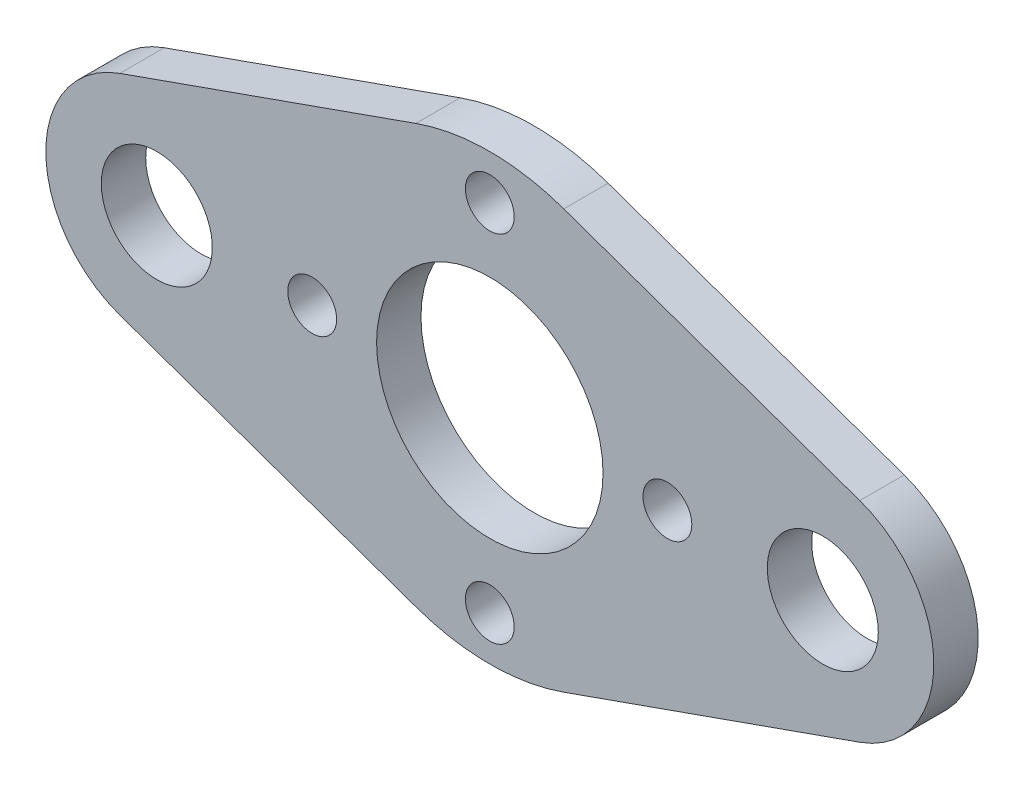
ISO-10303-21;
HEADER;
FILE_DESCRIPTION(('STEP AP214'),'2;1');
FILE_NAME('part.step','',(''),(''),'','','');
FILE_SCHEMA(('AUTOMOTIVE_DESIGN { 1 0 10303 214 1 1 1 1 }'));
ENDSEC;
DATA;
#1=APPLICATION_CONTEXT('core data for automotive mechanical design processes');
#2=APPLICATION_PROTOCOL_DEFINITION('international standard','automotive_design',2000,#1);
#3=PRODUCT_CONTEXT('',#1,'mechanical');
#4=PRODUCT('Part','Part','',(#3));
#5=PRODUCT_RELATED_PRODUCT_CATEGORY('part','',(#4));
#6=PRODUCT_DEFINITION_FORMATION('','',#4);
#7=PRODUCT_DEFINITION_CONTEXT('part definition',#1,'design');
#8=PRODUCT_DEFINITION('design','',#6,#7);
#9=PRODUCT_DEFINITION_SHAPE('','',#8);
#10=(LENGTH_UNIT() NAMED_UNIT(*) SI_UNIT(.MILLI.,.METRE.));
#11=(NAMED_UNIT(*) PLANE_ANGLE_UNIT() SI_UNIT($,.RADIAN.));
#12=(NAMED_UNIT(*) SI_UNIT($,.STERADIAN.) SOLID_ANGLE_UNIT());
#13=UNCERTAINTY_MEASURE_WITH_UNIT(LENGTH_MEASURE(1.E-05),#10,'distance_accuracy_value','');
#14=(GEOMETRIC_REPRESENTATION_CONTEXT(3) GLOBAL_UNCERTAINTY_ASSIGNED_CONTEXT((#13)) GLOBAL_UNIT_ASSIGNED_CONTEXT((#10,
#11,#12)) REPRESENTATION_CONTEXT('',''));
#15=CARTESIAN_POINT('',(0.,0.,0.));
#16=DIRECTION('',(0.,0.,1.));
#17=DIRECTION('',(1.,0.,0.));
#18=AXIS2_PLACEMENT_3D('',#15,#16,#17);
#19=CARTESIAN_POINT('',(0.,0.,2.));
#20=DIRECTION('',(0.,0.,1.));
#21=DIRECTION('',(1.,0.,0.));
#22=AXIS2_PLACEMENT_3D('',#19,#20,#21);
#23=PLANE('',#22);
#24=CARTESIAN_POINT('',(-8.,0.,2.));
#25=DIRECTION('',(0.,0.,1.));
#26=DIRECTION('',(1.,0.,0.));
#27=AXIS2_PLACEMENT_3D('',#24,#25,#26);
#28=CIRCLE('',#27,1.1);
#29=CARTESIAN_POINT('',(-6.9,0.,2.));
#30=VERTEX_POINT('',#29);
#31=EDGE_CURVE('E212',#30,#30,#28,.T.);
#32=ORIENTED_EDGE('',*,*,#31,.F.);
#33=EDGE_LOOP('',(#32));
#34=FACE_BOUND('',#33,.T.);
#35=CARTESIAN_POINT('',(8.,0.,2.));
#36=DIRECTION('',(0.,0.,1.));
#37=DIRECTION('',(1.,0.,0.));
#38=AXIS2_PLACEMENT_3D('',#35,#36,#37);
#39=CIRCLE('',#38,1.1);
#40=CARTESIAN_POINT('',(9.1,0.,2.));
#41=VERTEX_POINT('',#40);
#42=EDGE_CURVE('E200',#41,#41,#39,.T.);
#43=ORIENTED_EDGE('',*,*,#42,.F.);
#44=EDGE_LOOP('',(#43));
#45=FACE_BOUND('',#44,.T.);
#46=CARTESIAN_POINT('',(0.,8.,2.));
#47=DIRECTION('',(0.,0.,1.));
#48=DIRECTION('',(1.,0.,0.));
#49=AXIS2_PLACEMENT_3D('',#46,#47,#48);
#50=CIRCLE('',#49,1.1);
#51=CARTESIAN_POINT('',(1.1,8.,2.));
#52=VERTEX_POINT('',#51);
#53=EDGE_CURVE('E188',#52,#52,#50,.T.);
#54=ORIENTED_EDGE('',*,*,#53,.F.);
#55=EDGE_LOOP('',(#54));
#56=FACE_BOUND('',#55,.T.);
#57=CARTESIAN_POINT('',(0.,0.,2.));
#58=DIRECTION('',(0.,0.,1.));
#59=DIRECTION('',(1.,0.,0.));
#60=AXIS2_PLACEMENT_3D('',#57,#58,#59);
#61=CIRCLE('',#60,10.);
#62=CARTESIAN_POINT('',(3.33333333333333,9.42809041582063,2.));
#63=VERTEX_POINT('',#62);
#64=CARTESIAN_POINT('',(-3.33333333333333,9.42809041582063,2.));
#65=VERTEX_POINT('',#64);
#66=EDGE_CURVE('E151',#63,#65,#61,.T.);
#67=ORIENTED_EDGE('',*,*,#66,.T.);
#68=DIRECTION('',(-0.942809041582063,-0.333333333333333,0.));
#69=VECTOR('',#68,1.);
#70=CARTESIAN_POINT('',(-3.33333333333333,9.42809041582063,2.));
#71=LINE('',#70,#69);
#72=CARTESIAN_POINT('',(-16.6666666666667,4.71404520791031,2.));
#73=VERTEX_POINT('',#72);
#74=EDGE_CURVE('E99',#65,#73,#71,.T.);
#75=ORIENTED_EDGE('',*,*,#74,.T.);
#76=CARTESIAN_POINT('',(-15.,0.,2.));
#77=DIRECTION('',(0.,0.,1.));
#78=DIRECTION('',(-1.,0.,0.));
#79=AXIS2_PLACEMENT_3D('',#76,#77,#78);
#80=CIRCLE('',#79,5.);
#81=CARTESIAN_POINT('',(-16.6666666666667,-4.71404520791031,2.));
#82=VERTEX_POINT('',#81);
#83=EDGE_CURVE('E166',#73,#82,#80,.T.);
#84=ORIENTED_EDGE('',*,*,#83,.T.);
#85=DIRECTION('',(0.942809041582063,-0.333333333333333,0.));
#86=VECTOR('',#85,1.);
#87=CARTESIAN_POINT('',(-3.33333333333333,-9.42809041582063,2.));
#88=LINE('',#87,#86);
#89=CARTESIAN_POINT('',(-3.33333333333334,-9.42809041582063,2.));
#90=VERTEX_POINT('',#89);
#91=EDGE_CURVE('E179',#82,#90,#88,.T.);
#92=ORIENTED_EDGE('',*,*,#91,.T.);
#93=CARTESIAN_POINT('',(0.,0.,2.));
#94=DIRECTION('',(0.,0.,1.));
#95=DIRECTION('',(1.,0.,0.));
#96=AXIS2_PLACEMENT_3D('',#93,#94,#95);
#97=CIRCLE('',#96,9.99999999999999);
#98=CARTESIAN_POINT('',(3.33333333333333,-9.42809041582063,2.));
#99=VERTEX_POINT('',#98);
#100=EDGE_CURVE('E118',#90,#99,#97,.T.);
#101=ORIENTED_EDGE('',*,*,#100,.T.);
#102=DIRECTION('',(0.942809041582063,0.333333333333333,0.));
#103=VECTOR('',#102,1.);
#104=CARTESIAN_POINT('',(3.33333333333333,-9.42809041582063,2.));
#105=LINE('',#104,#103);
#106=CARTESIAN_POINT('',(16.6666666666667,-4.71404520791031,2.));
#107=VERTEX_POINT('',#106);
#108=EDGE_CURVE('E112',#99,#107,#105,.T.);
#109=ORIENTED_EDGE('',*,*,#108,.T.);
#110=CARTESIAN_POINT('',(15.,0.,2.));
#111=DIRECTION('',(0.,0.,1.));
#112=DIRECTION('',(1.,0.,0.));
#113=AXIS2_PLACEMENT_3D('',#110,#111,#112);
#114=CIRCLE('',#113,5.);
#115=CARTESIAN_POINT('',(16.6666666666667,4.71404520791031,2.));
#116=VERTEX_POINT('',#115);
#117=EDGE_CURVE('E116',#107,#116,#114,.T.);
#118=ORIENTED_EDGE('',*,*,#117,.T.);
#119=DIRECTION('',(-0.942809041582063,0.333333333333333,0.));
#120=VECTOR('',#119,1.);
#121=CARTESIAN_POINT('',(3.33333333333333,9.42809041582063,2.));
#122=LINE('',#121,#120);
#123=EDGE_CURVE('E56',#116,#63,#122,.T.);
#124=ORIENTED_EDGE('',*,*,#123,.T.);
#125=EDGE_LOOP('',(#67,#75,#84,#92,#101,#109,#118,#124));
#126=FACE_BOUND('',#125,.T.);
#127=CARTESIAN_POINT('',(15.,0.,2.));
#128=DIRECTION('',(0.,0.,1.));
#129=DIRECTION('',(1.,0.,0.));
#130=AXIS2_PLACEMENT_3D('',#127,#128,#129);
#131=CIRCLE('',#130,2.5);
#132=CARTESIAN_POINT('',(17.5,0.,2.));
#133=VERTEX_POINT('',#132);
#134=EDGE_CURVE('E140',#133,#133,#131,.T.);
#135=ORIENTED_EDGE('',*,*,#134,.F.);
#136=EDGE_LOOP('',(#135));
#137=FACE_BOUND('',#136,.T.);
#138=CARTESIAN_POINT('',(0.,0.,2.));
#139=DIRECTION('',(0.,0.,1.));
#140=DIRECTION('',(1.,0.,0.));
#141=AXIS2_PLACEMENT_3D('',#138,#139,#140);
#142=CIRCLE('',#141,5.1);
#143=CARTESIAN_POINT('',(5.1,0.,2.));
#144=VERTEX_POINT('',#143);
#145=EDGE_CURVE('E194',#144,#144,#142,.T.);
#146=ORIENTED_EDGE('',*,*,#145,.F.);
#147=EDGE_LOOP('',(#146));
#148=FACE_BOUND('',#147,.T.);
#149=CARTESIAN_POINT('',(0.,-8.,2.));
#150=DIRECTION('',(0.,0.,1.));
#151=DIRECTION('',(1.,0.,0.));
#152=AXIS2_PLACEMENT_3D('',#149,#150,#151);
#153=CIRCLE('',#152,1.1);
#154=CARTESIAN_POINT('',(1.1,-8.,2.));
#155=VERTEX_POINT('',#154);
#156=EDGE_CURVE('E206',#155,#155,#153,.T.);
#157=ORIENTED_EDGE('',*,*,#156,.F.);
#158=EDGE_LOOP('',(#157));
#159=FACE_BOUND('',#158,.T.);
#160=CARTESIAN_POINT('',(-15.,0.,2.));
#161=DIRECTION('',(0.,0.,1.));
#162=DIRECTION('',(-1.,0.,0.));
#163=AXIS2_PLACEMENT_3D('',#160,#161,#162);
#164=CIRCLE('',#163,2.5);
#165=CARTESIAN_POINT('',(-17.5,0.,2.));
#166=VERTEX_POINT('',#165);
#167=EDGE_CURVE('E218',#166,#166,#164,.T.);
#168=ORIENTED_EDGE('',*,*,#167,.F.);
#169=EDGE_LOOP('',(#168));
#170=FACE_BOUND('',#169,.T.);
#171=ADVANCED_FACE('F39',(#34,#45,#56,#126,#137,#148,#159,#170),#23,.T.);
#172=CARTESIAN_POINT('',(0.,0.,0.));
#173=DIRECTION('',(0.,0.,1.));
#174=DIRECTION('',(1.,0.,0.));
#175=AXIS2_PLACEMENT_3D('',#172,#173,#174);
#176=PLANE('',#175);
#177=CARTESIAN_POINT('',(0.,0.,0.));
#178=DIRECTION('',(0.,0.,1.));
#179=DIRECTION('',(1.,0.,0.));
#180=AXIS2_PLACEMENT_3D('',#177,#178,#179);
#181=CIRCLE('',#180,10.);
#182=CARTESIAN_POINT('',(3.33333333333333,9.42809041582063,0.));
#183=VERTEX_POINT('',#182);
#184=CARTESIAN_POINT('',(-3.33333333333333,9.42809041582063,0.));
#185=VERTEX_POINT('',#184);
#186=EDGE_CURVE('E136',#183,#185,#181,.T.);
#187=ORIENTED_EDGE('',*,*,#186,.F.);
#188=DIRECTION('',(-0.942809041582063,0.333333333333333,0.));
#189=VECTOR('',#188,1.);
#190=CARTESIAN_POINT('',(3.33333333333333,9.42809041582063,0.));
#191=LINE('',#190,#189);
#192=CARTESIAN_POINT('',(16.6666666666667,4.71404520791031,0.));
#193=VERTEX_POINT('',#192);
#194=EDGE_CURVE('E91',#193,#183,#191,.T.);
#195=ORIENTED_EDGE('',*,*,#194,.F.);
#196=CARTESIAN_POINT('',(15.,0.,0.));
#197=DIRECTION('',(0.,0.,1.));
#198=DIRECTION('',(1.,0.,0.));
#199=AXIS2_PLACEMENT_3D('',#196,#197,#198);
#200=CIRCLE('',#199,5.);
#201=CARTESIAN_POINT('',(16.6666666666667,-4.71404520791031,0.));
#202=VERTEX_POINT('',#201);
#203=EDGE_CURVE('E85',#202,#193,#200,.T.);
#204=ORIENTED_EDGE('',*,*,#203,.F.);
#205=DIRECTION('',(0.942809041582063,0.333333333333333,0.));
#206=VECTOR('',#205,1.);
#207=CARTESIAN_POINT('',(3.33333333333333,-9.42809041582063,0.));
#208=LINE('',#207,#206);
#209=CARTESIAN_POINT('',(3.33333333333333,-9.42809041582063,0.));
#210=VERTEX_POINT('',#209);
#211=EDGE_CURVE('E126',#210,#202,#208,.T.);
#212=ORIENTED_EDGE('',*,*,#211,.F.);
#213=CARTESIAN_POINT('',(0.,0.,0.));
#214=DIRECTION('',(0.,0.,1.));
#215=DIRECTION('',(1.,0.,0.));
#216=AXIS2_PLACEMENT_3D('',#213,#214,#215);
#217=CIRCLE('',#216,9.99999999999999);
#218=CARTESIAN_POINT('',(-3.33333333333334,-9.42809041582063,0.));
#219=VERTEX_POINT('',#218);
#220=EDGE_CURVE('E146',#219,#210,#217,.T.);
#221=ORIENTED_EDGE('',*,*,#220,.F.);
#222=DIRECTION('',(0.942809041582063,-0.333333333333333,0.));
#223=VECTOR('',#222,1.);
#224=CARTESIAN_POINT('',(-3.33333333333333,-9.42809041582063,0.));
#225=LINE('',#224,#223);
#226=CARTESIAN_POINT('',(-16.6666666666667,-4.71404520791031,0.));
#227=VERTEX_POINT('',#226);
#228=EDGE_CURVE('E144',#227,#219,#225,.T.);
#229=ORIENTED_EDGE('',*,*,#228,.F.);
#230=CARTESIAN_POINT('',(-15.,0.,0.));
#231=DIRECTION('',(0.,0.,1.));
#232=DIRECTION('',(-1.,0.,0.));
#233=AXIS2_PLACEMENT_3D('',#230,#231,#232);
#234=CIRCLE('',#233,5.);
#235=CARTESIAN_POINT('',(-16.6666666666667,4.71404520791031,0.));
#236=VERTEX_POINT('',#235);
#237=EDGE_CURVE('E142',#236,#227,#234,.T.);
#238=ORIENTED_EDGE('',*,*,#237,.F.);
#239=DIRECTION('',(-0.942809041582063,-0.333333333333333,0.));
#240=VECTOR('',#239,1.);
#241=CARTESIAN_POINT('',(-3.33333333333333,9.42809041582063,0.));
#242=LINE('',#241,#240);
#243=EDGE_CURVE('E139',#185,#236,#242,.T.);
#244=ORIENTED_EDGE('',*,*,#243,.F.);
#245=EDGE_LOOP('',(#187,#195,#204,#212,#221,#229,#238,#244));
#246=FACE_BOUND('',#245,.T.);
#247=CARTESIAN_POINT('',(15.,0.,0.));
#248=DIRECTION('',(0.,0.,1.));
#249=DIRECTION('',(1.,0.,0.));
#250=AXIS2_PLACEMENT_3D('',#247,#248,#249);
#251=CIRCLE('',#250,2.5);
#252=CARTESIAN_POINT('',(17.5,0.,0.));
#253=VERTEX_POINT('',#252);
#254=EDGE_CURVE('E185',#253,#253,#251,.T.);
#255=ORIENTED_EDGE('',*,*,#254,.T.);
#256=EDGE_LOOP('',(#255));
#257=FACE_BOUND('',#256,.T.);
#258=CARTESIAN_POINT('',(0.,8.,0.));
#259=DIRECTION('',(0.,0.,1.));
#260=DIRECTION('',(1.,0.,0.));
#261=AXIS2_PLACEMENT_3D('',#258,#259,#260);
#262=CIRCLE('',#261,1.1);
#263=CARTESIAN_POINT('',(1.1,8.,0.));
#264=VERTEX_POINT('',#263);
#265=EDGE_CURVE('E191',#264,#264,#262,.T.);
#266=ORIENTED_EDGE('',*,*,#265,.T.);
#267=EDGE_LOOP('',(#266));
#268=FACE_BOUND('',#267,.T.);
#269=CARTESIAN_POINT('',(0.,0.,0.));
#270=DIRECTION('',(0.,0.,1.));
#271=DIRECTION('',(1.,0.,0.));
#272=AXIS2_PLACEMENT_3D('',#269,#270,#271);
#273=CIRCLE('',#272,5.1);
#274=CARTESIAN_POINT('',(5.1,0.,0.));
#275=VERTEX_POINT('',#274);
#276=EDGE_CURVE('E197',#275,#275,#273,.T.);
#277=ORIENTED_EDGE('',*,*,#276,.T.);
#278=EDGE_LOOP('',(#277));
#279=FACE_BOUND('',#278,.T.);
#280=CARTESIAN_POINT('',(8.,0.,0.));
#281=DIRECTION('',(0.,0.,1.));
#282=DIRECTION('',(1.,0.,0.));
#283=AXIS2_PLACEMENT_3D('',#280,#281,#282);
#284=CIRCLE('',#283,1.1);
#285=CARTESIAN_POINT('',(9.1,0.,0.));
#286=VERTEX_POINT('',#285);
#287=EDGE_CURVE('E203',#286,#286,#284,.T.);
#288=ORIENTED_EDGE('',*,*,#287,.T.);
#289=EDGE_LOOP('',(#288));
#290=FACE_BOUND('',#289,.T.);
#291=CARTESIAN_POINT('',(0.,-8.,0.));
#292=DIRECTION('',(0.,0.,1.));
#293=DIRECTION('',(1.,0.,0.));
#294=AXIS2_PLACEMENT_3D('',#291,#292,#293);
#295=CIRCLE('',#294,1.1);
#296=CARTESIAN_POINT('',(1.1,-8.,0.));
#297=VERTEX_POINT('',#296);
#298=EDGE_CURVE('E209',#297,#297,#295,.T.);
#299=ORIENTED_EDGE('',*,*,#298,.T.);
#300=EDGE_LOOP('',(#299));
#301=FACE_BOUND('',#300,.T.);
#302=CARTESIAN_POINT('',(-8.,0.,0.));
#303=DIRECTION('',(0.,0.,1.));
#304=DIRECTION('',(1.,0.,0.));
#305=AXIS2_PLACEMENT_3D('',#302,#303,#304);
#306=CIRCLE('',#305,1.1);
#307=CARTESIAN_POINT('',(-6.9,0.,0.));
#308=VERTEX_POINT('',#307);
#309=EDGE_CURVE('E215',#308,#308,#306,.T.);
#310=ORIENTED_EDGE('',*,*,#309,.T.);
#311=EDGE_LOOP('',(#310));
#312=FACE_BOUND('',#311,.T.);
#313=CARTESIAN_POINT('',(-15.,0.,0.));
#314=DIRECTION('',(0.,0.,1.));
#315=DIRECTION('',(-1.,0.,0.));
#316=AXIS2_PLACEMENT_3D('',#313,#314,#315);
#317=CIRCLE('',#316,2.5);
#318=CARTESIAN_POINT('',(-17.5,0.,0.));
#319=VERTEX_POINT('',#318);
#320=EDGE_CURVE('E221',#319,#319,#317,.T.);
#321=ORIENTED_EDGE('',*,*,#320,.T.);
#322=EDGE_LOOP('',(#321));
#323=FACE_BOUND('',#322,.T.);
#324=ADVANCED_FACE('F170',(#246,#257,#268,#279,#290,#301,#312,#323),#176,.F.);
#325=CARTESIAN_POINT('',(0.,0.,2.));
#326=DIRECTION('',(0.,0.,-1.));
#327=DIRECTION('',(-1.,0.,0.));
#328=AXIS2_PLACEMENT_3D('',#325,#326,#327);
#329=CYLINDRICAL_SURFACE('',#328,10.);
#330=ORIENTED_EDGE('',*,*,#186,.T.);
#331=DIRECTION('',(0.,0.,-1.));
#332=VECTOR('',#331,1.);
#333=CARTESIAN_POINT('',(-3.33333333333333,9.42809041582063,2.));
#334=LINE('',#333,#332);
#335=EDGE_CURVE('E11',#65,#185,#334,.T.);
#336=ORIENTED_EDGE('',*,*,#335,.F.);
#337=ORIENTED_EDGE('',*,*,#66,.F.);
#338=DIRECTION('',(0.,0.,-1.));
#339=VECTOR('',#338,1.);
#340=CARTESIAN_POINT('',(3.33333333333333,9.42809041582063,2.));
#341=LINE('',#340,#339);
#342=EDGE_CURVE('E132',#63,#183,#341,.T.);
#343=ORIENTED_EDGE('',*,*,#342,.T.);
#344=EDGE_LOOP('',(#330,#336,#337,#343));
#345=FACE_BOUND('',#344,.T.);
#346=ADVANCED_FACE('F41',(#345),#329,.T.);
#347=CARTESIAN_POINT('',(-3.33333333333333,9.42809041582063,2.));
#348=DIRECTION('',(0.333333333333333,-0.942809041582063,0.));
#349=DIRECTION('',(0.942809041582064,0.333333333333333,0.));
#350=AXIS2_PLACEMENT_3D('',#347,#348,#349);
#351=PLANE('',#350);
#352=ORIENTED_EDGE('',*,*,#243,.T.);
#353=DIRECTION('',(0.,0.,-1.));
#354=VECTOR('',#353,1.);
#355=CARTESIAN_POINT('',(-16.6666666666667,4.71404520791031,2.));
#356=LINE('',#355,#354);
#357=EDGE_CURVE('E48',#73,#236,#356,.T.);
#358=ORIENTED_EDGE('',*,*,#357,.F.);
#359=ORIENTED_EDGE('',*,*,#74,.F.);
#360=ORIENTED_EDGE('',*,*,#335,.T.);
#361=EDGE_LOOP('',(#352,#358,#359,#360));
#362=FACE_BOUND('',#361,.T.);
#363=ADVANCED_FACE('F255',(#362),#351,.F.);
#364=CARTESIAN_POINT('',(-15.,0.,2.));
#365=DIRECTION('',(0.,0.,-1.));
#366=DIRECTION('',(-1.,0.,0.));
#367=AXIS2_PLACEMENT_3D('',#364,#365,#366);
#368=CYLINDRICAL_SURFACE('',#367,5.);
#369=ORIENTED_EDGE('',*,*,#237,.T.);
#370=DIRECTION('',(0.,0.,-1.));
#371=VECTOR('',#370,1.);
#372=CARTESIAN_POINT('',(-16.6666666666667,-4.71404520791031,2.));
#373=LINE('',#372,#371);
#374=EDGE_CURVE('E158',#82,#227,#373,.T.);
#375=ORIENTED_EDGE('',*,*,#374,.F.);
#376=ORIENTED_EDGE('',*,*,#83,.F.);
#377=ORIENTED_EDGE('',*,*,#357,.T.);
#378=EDGE_LOOP('',(#369,#375,#376,#377));
#379=FACE_BOUND('',#378,.T.);
#380=ADVANCED_FACE('F164',(#379),#368,.T.);
#381=CARTESIAN_POINT('',(-3.33333333333333,-9.42809041582063,2.));
#382=DIRECTION('',(0.333333333333333,0.942809041582063,0.));
#383=DIRECTION('',(-0.942809041582063,0.333333333333333,0.));
#384=AXIS2_PLACEMENT_3D('',#381,#382,#383);
#385=PLANE('',#384);
#386=ORIENTED_EDGE('',*,*,#228,.T.);
#387=DIRECTION('',(0.,0.,-1.));
#388=VECTOR('',#387,1.);
#389=CARTESIAN_POINT('',(-3.33333333333334,-9.42809041582063,2.));
#390=LINE('',#389,#388);
#391=EDGE_CURVE('E155',#90,#219,#390,.T.);
#392=ORIENTED_EDGE('',*,*,#391,.F.);
#393=ORIENTED_EDGE('',*,*,#91,.F.);
#394=ORIENTED_EDGE('',*,*,#374,.T.);
#395=EDGE_LOOP('',(#386,#392,#393,#394));
#396=FACE_BOUND('',#395,.T.);
#397=ADVANCED_FACE('F175',(#396),#385,.F.);
#398=CARTESIAN_POINT('',(0.,0.,2.));
#399=DIRECTION('',(0.,0.,-1.));
#400=DIRECTION('',(-1.,0.,0.));
#401=AXIS2_PLACEMENT_3D('',#398,#399,#400);
#402=CYLINDRICAL_SURFACE('',#401,9.99999999999999);
#403=ORIENTED_EDGE('',*,*,#220,.T.);
#404=DIRECTION('',(0.,0.,-1.));
#405=VECTOR('',#404,1.);
#406=CARTESIAN_POINT('',(3.33333333333333,-9.42809041582063,2.));
#407=LINE('',#406,#405);
#408=EDGE_CURVE('E127',#99,#210,#407,.T.);
#409=ORIENTED_EDGE('',*,*,#408,.F.);
#410=ORIENTED_EDGE('',*,*,#100,.F.);
#411=ORIENTED_EDGE('',*,*,#391,.T.);
#412=EDGE_LOOP('',(#403,#409,#410,#411));
#413=FACE_BOUND('',#412,.T.);
#414=ADVANCED_FACE('F178',(#413),#402,.T.);
#415=CARTESIAN_POINT('',(3.33333333333333,-9.42809041582063,2.));
#416=DIRECTION('',(-0.333333333333333,0.942809041582063,0.));
#417=DIRECTION('',(-0.942809041582063,-0.333333333333333,0.));
#418=AXIS2_PLACEMENT_3D('',#415,#416,#417);
#419=PLANE('',#418);
#420=ORIENTED_EDGE('',*,*,#211,.T.);
#421=DIRECTION('',(0.,0.,-1.));
#422=VECTOR('',#421,1.);
#423=CARTESIAN_POINT('',(16.6666666666667,-4.71404520791031,2.));
#424=LINE('',#423,#422);
#425=EDGE_CURVE('E123',#107,#202,#424,.T.);
#426=ORIENTED_EDGE('',*,*,#425,.F.);
#427=ORIENTED_EDGE('',*,*,#108,.F.);
#428=ORIENTED_EDGE('',*,*,#408,.T.);
#429=EDGE_LOOP('',(#420,#426,#427,#428));
#430=FACE_BOUND('',#429,.T.);
#431=ADVANCED_FACE('F124',(#430),#419,.F.);
#432=CARTESIAN_POINT('',(15.,0.,2.));
#433=DIRECTION('',(0.,0.,-1.));
#434=DIRECTION('',(-1.,0.,0.));
#435=AXIS2_PLACEMENT_3D('',#432,#433,#434);
#436=CYLINDRICAL_SURFACE('',#435,5.);
#437=ORIENTED_EDGE('',*,*,#203,.T.);
#438=DIRECTION('',(0.,0.,-1.));
#439=VECTOR('',#438,1.);
#440=CARTESIAN_POINT('',(16.6666666666667,4.71404520791031,2.));
#441=LINE('',#440,#439);
#442=EDGE_CURVE('E128',#116,#193,#441,.T.);
#443=ORIENTED_EDGE('',*,*,#442,.F.);
#444=ORIENTED_EDGE('',*,*,#117,.F.);
#445=ORIENTED_EDGE('',*,*,#425,.T.);
#446=EDGE_LOOP('',(#437,#443,#444,#445));
#447=FACE_BOUND('',#446,.T.);
#448=ADVANCED_FACE('F130',(#447),#436,.T.);
#449=CARTESIAN_POINT('',(3.33333333333333,9.42809041582063,2.));
#450=DIRECTION('',(-0.333333333333333,-0.942809041582063,0.));
#451=DIRECTION('',(0.942809041582064,-0.333333333333333,0.));
#452=AXIS2_PLACEMENT_3D('',#449,#450,#451);
#453=PLANE('',#452);
#454=ORIENTED_EDGE('',*,*,#194,.T.);
#455=ORIENTED_EDGE('',*,*,#342,.F.);
#456=ORIENTED_EDGE('',*,*,#123,.F.);
#457=ORIENTED_EDGE('',*,*,#442,.T.);
#458=EDGE_LOOP('',(#454,#455,#456,#457));
#459=FACE_BOUND('',#458,.T.);
#460=ADVANCED_FACE('F243',(#459),#453,.F.);
#461=CARTESIAN_POINT('',(15.,0.,2.));
#462=DIRECTION('',(0.,0.,-1.));
#463=DIRECTION('',(-1.,0.,0.));
#464=AXIS2_PLACEMENT_3D('',#461,#462,#463);
#465=CYLINDRICAL_SURFACE('',#464,2.5);
#466=ORIENTED_EDGE('',*,*,#134,.T.);
#467=EDGE_LOOP('',(#466));
#468=FACE_BOUND('',#467,.T.);
#469=ORIENTED_EDGE('',*,*,#254,.F.);
#470=EDGE_LOOP('',(#469));
#471=FACE_BOUND('',#470,.T.);
#472=ADVANCED_FACE('F240',(#468,#471),#465,.F.);
#473=CARTESIAN_POINT('',(0.,8.,2.));
#474=DIRECTION('',(0.,0.,-1.));
#475=DIRECTION('',(-1.,0.,0.));
#476=AXIS2_PLACEMENT_3D('',#473,#474,#475);
#477=CYLINDRICAL_SURFACE('',#476,1.1);
#478=ORIENTED_EDGE('',*,*,#53,.T.);
#479=EDGE_LOOP('',(#478));
#480=FACE_BOUND('',#479,.T.);
#481=ORIENTED_EDGE('',*,*,#265,.F.);
#482=EDGE_LOOP('',(#481));
#483=FACE_BOUND('',#482,.T.);
#484=ADVANCED_FACE('F304',(#480,#483),#477,.F.);
#485=CARTESIAN_POINT('',(0.,0.,2.));
#486=DIRECTION('',(0.,0.,-1.));
#487=DIRECTION('',(-1.,0.,0.));
#488=AXIS2_PLACEMENT_3D('',#485,#486,#487);
#489=CYLINDRICAL_SURFACE('',#488,5.1);
#490=ORIENTED_EDGE('',*,*,#145,.T.);
#491=EDGE_LOOP('',(#490));
#492=FACE_BOUND('',#491,.T.);
#493=ORIENTED_EDGE('',*,*,#276,.F.);
#494=EDGE_LOOP('',(#493));
#495=FACE_BOUND('',#494,.T.);
#496=ADVANCED_FACE('F311',(#492,#495),#489,.F.);
#497=CARTESIAN_POINT('',(8.,0.,2.));
#498=DIRECTION('',(0.,0.,-1.));
#499=DIRECTION('',(-1.,0.,0.));
#500=AXIS2_PLACEMENT_3D('',#497,#498,#499);
#501=CYLINDRICAL_SURFACE('',#500,1.1);
#502=ORIENTED_EDGE('',*,*,#42,.T.);
#503=EDGE_LOOP('',(#502));
#504=FACE_BOUND('',#503,.T.);
#505=ORIENTED_EDGE('',*,*,#287,.F.);
#506=EDGE_LOOP('',(#505));
#507=FACE_BOUND('',#506,.T.);
#508=ADVANCED_FACE('F318',(#504,#507),#501,.F.);
#509=CARTESIAN_POINT('',(0.,-8.,2.));
#510=DIRECTION('',(0.,0.,-1.));
#511=DIRECTION('',(-1.,0.,0.));
#512=AXIS2_PLACEMENT_3D('',#509,#510,#511);
#513=CYLINDRICAL_SURFACE('',#512,1.1);
#514=ORIENTED_EDGE('',*,*,#156,.T.);
#515=EDGE_LOOP('',(#514));
#516=FACE_BOUND('',#515,.T.);
#517=ORIENTED_EDGE('',*,*,#298,.F.);
#518=EDGE_LOOP('',(#517));
#519=FACE_BOUND('',#518,.T.);
#520=ADVANCED_FACE('F326',(#516,#519),#513,.F.);
#521=CARTESIAN_POINT('',(-8.,0.,2.));
#522=DIRECTION('',(0.,0.,-1.));
#523=DIRECTION('',(-1.,0.,0.));
#524=AXIS2_PLACEMENT_3D('',#521,#522,#523);
#525=CYLINDRICAL_SURFACE('',#524,1.1);
#526=ORIENTED_EDGE('',*,*,#31,.T.);
#527=EDGE_LOOP('',(#526));
#528=FACE_BOUND('',#527,.T.);
#529=ORIENTED_EDGE('',*,*,#309,.F.);
#530=EDGE_LOOP('',(#529));
#531=FACE_BOUND('',#530,.T.);
#532=ADVANCED_FACE('F334',(#528,#531),#525,.F.);
#533=CARTESIAN_POINT('',(-15.,0.,2.));
#534=DIRECTION('',(0.,0.,-1.));
#535=DIRECTION('',(-1.,0.,0.));
#536=AXIS2_PLACEMENT_3D('',#533,#534,#535);
#537=CYLINDRICAL_SURFACE('',#536,2.5);
#538=ORIENTED_EDGE('',*,*,#167,.T.);
#539=EDGE_LOOP('',(#538));
#540=FACE_BOUND('',#539,.T.);
#541=ORIENTED_EDGE('',*,*,#320,.F.);
#542=EDGE_LOOP('',(#541));
#543=FACE_BOUND('',#542,.T.);
#544=ADVANCED_FACE('F227',(#540,#543),#537,.F.);
#545=CLOSED_SHELL('',(#171,#324,#346,#363,#380,#397,#414,#431,#448,#460,#472,#484,#496,#508,
#520,#532,#544));
#546=MANIFOLD_SOLID_BREP('B2',#545);
#547=ADVANCED_BREP_SHAPE_REPRESENTATION('',(#18,#546),#14);
#548=SHAPE_DEFINITION_REPRESENTATION(#9,#547);
ENDSEC;
END-ISO-10303-21;
